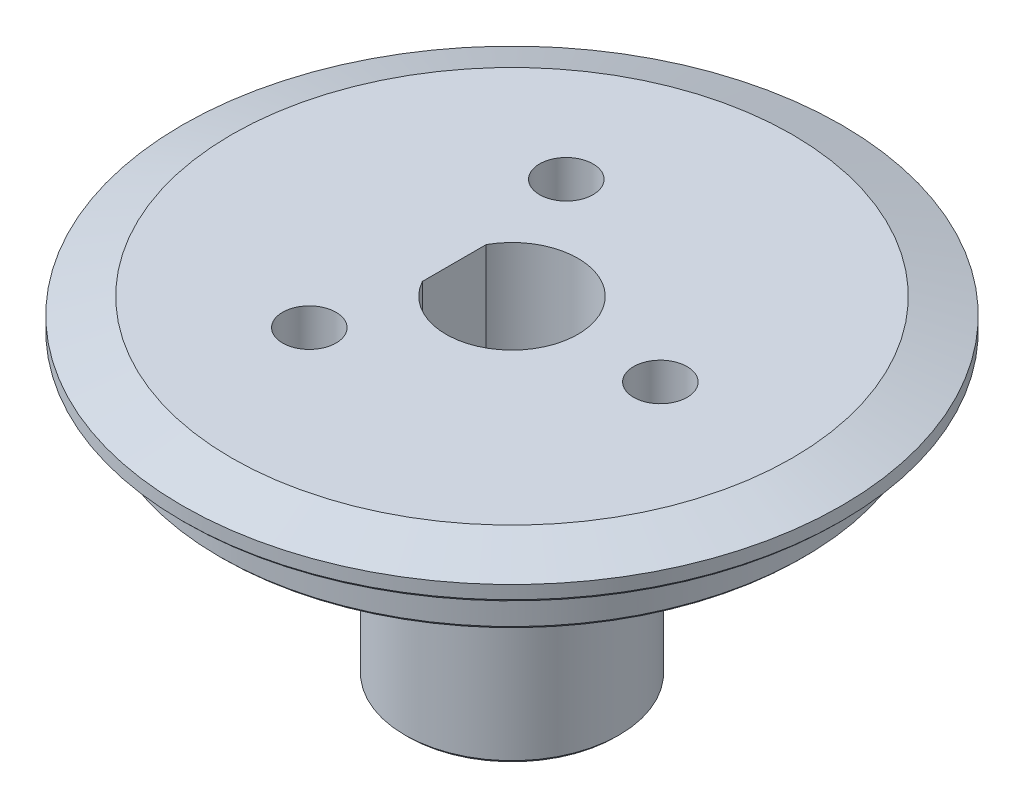
ISO-10303-21;
HEADER;
FILE_DESCRIPTION(('STEP AP214'),'2;1');
FILE_NAME('part.step','',(''),(''),'','','');
FILE_SCHEMA(('AUTOMOTIVE_DESIGN { 1 0 10303 214 1 1 1 1 }'));
ENDSEC;
DATA;
#1=APPLICATION_CONTEXT('core data for automotive mechanical design processes');
#2=APPLICATION_PROTOCOL_DEFINITION('international standard','automotive_design',2000,#1);
#3=PRODUCT_CONTEXT('',#1,'mechanical');
#4=PRODUCT('Part','Part','',(#3));
#5=PRODUCT_RELATED_PRODUCT_CATEGORY('part','',(#4));
#6=PRODUCT_DEFINITION_FORMATION('','',#4);
#7=PRODUCT_DEFINITION_CONTEXT('part definition',#1,'design');
#8=PRODUCT_DEFINITION('design','',#6,#7);
#9=PRODUCT_DEFINITION_SHAPE('','',#8);
#10=(LENGTH_UNIT() NAMED_UNIT(*) SI_UNIT(.MILLI.,.METRE.));
#11=(NAMED_UNIT(*) PLANE_ANGLE_UNIT() SI_UNIT($,.RADIAN.));
#12=(NAMED_UNIT(*) SI_UNIT($,.STERADIAN.) SOLID_ANGLE_UNIT());
#13=UNCERTAINTY_MEASURE_WITH_UNIT(LENGTH_MEASURE(1.E-05),#10,'distance_accuracy_value','');
#14=(GEOMETRIC_REPRESENTATION_CONTEXT(3) GLOBAL_UNCERTAINTY_ASSIGNED_CONTEXT((#13)) GLOBAL_UNIT_ASSIGNED_CONTEXT((#10,
#11,#12)) REPRESENTATION_CONTEXT('',''));
#15=CARTESIAN_POINT('',(0.,0.,0.));
#16=DIRECTION('',(0.,0.,1.));
#17=DIRECTION('',(1.,0.,0.));
#18=AXIS2_PLACEMENT_3D('',#15,#16,#17);
#19=CARTESIAN_POINT('',(0.,17.8,0.));
#20=DIRECTION('',(0.,-1.,0.));
#21=DIRECTION('',(0.,0.,-1.));
#22=AXIS2_PLACEMENT_3D('',#19,#20,#21);
#23=TOROIDAL_SURFACE('',#22,17.95,0.2);
#24=CARTESIAN_POINT('',(0.,17.8,0.));
#25=DIRECTION('',(0.,-1.,0.));
#26=DIRECTION('',(0.,0.,-1.));
#27=AXIS2_PLACEMENT_3D('',#24,#25,#26);
#28=CIRCLE('',#27,17.75);
#29=CARTESIAN_POINT('',(0.,17.8,-17.75));
#30=VERTEX_POINT('',#29);
#31=EDGE_CURVE('E110',#30,#30,#28,.T.);
#32=ORIENTED_EDGE('',*,*,#31,.F.);
#33=EDGE_LOOP('',(#32));
#34=FACE_BOUND('',#33,.T.);
#35=CARTESIAN_POINT('',(0.,18.,0.));
#36=DIRECTION('',(0.,-1.,0.));
#37=DIRECTION('',(1.,0.,0.));
#38=AXIS2_PLACEMENT_3D('',#35,#36,#37);
#39=CIRCLE('',#38,17.95);
#40=CARTESIAN_POINT('',(17.95,18.,0.));
#41=VERTEX_POINT('',#40);
#42=EDGE_CURVE('E113',#41,#41,#39,.F.);
#43=ORIENTED_EDGE('',*,*,#42,.F.);
#44=EDGE_LOOP('',(#43));
#45=FACE_BOUND('',#44,.T.);
#46=ADVANCED_FACE('F17',(#34,#45),#23,.F.);
#47=CARTESIAN_POINT('',(18.875,18.,0.));
#48=DIRECTION('',(0.,-1.,0.));
#49=DIRECTION('',(0.,0.,-1.));
#50=AXIS2_PLACEMENT_3D('',#47,#48,#49);
#51=PLANE('',#50);
#52=ORIENTED_EDGE('',*,*,#42,.T.);
#53=EDGE_LOOP('',(#52));
#54=FACE_BOUND('',#53,.T.);
#55=CARTESIAN_POINT('',(0.,17.9999999999103,0.));
#56=DIRECTION('',(0.,1.,0.));
#57=DIRECTION('',(0.,0.,1.));
#58=AXIS2_PLACEMENT_3D('',#55,#56,#57);
#59=CIRCLE('',#58,19.8000000000897);
#60=CARTESIAN_POINT('',(0.,17.9999999999103,19.8000000000897));
#61=VERTEX_POINT('',#60);
#62=EDGE_CURVE('E22',#61,#61,#59,.T.);
#63=ORIENTED_EDGE('',*,*,#62,.F.);
#64=EDGE_LOOP('',(#63));
#65=FACE_BOUND('',#64,.T.);
#66=ADVANCED_FACE('F124',(#54,#65),#51,.T.);
#67=CARTESIAN_POINT('',(0.,16.5,0.));
#68=DIRECTION('',(0.,-1.,0.));
#69=DIRECTION('',(0.,0.,-1.));
#70=AXIS2_PLACEMENT_3D('',#67,#68,#69);
#71=CYLINDRICAL_SURFACE('',#70,17.75);
#72=ORIENTED_EDGE('',*,*,#31,.T.);
#73=EDGE_LOOP('',(#72));
#74=FACE_BOUND('',#73,.T.);
#75=CARTESIAN_POINT('',(0.,15.2000000000898,0.));
#76=DIRECTION('',(0.,1.,0.));
#77=DIRECTION('',(-1.,0.,0.));
#78=AXIS2_PLACEMENT_3D('',#75,#76,#77);
#79=CIRCLE('',#78,17.7499999999103);
#80=CARTESIAN_POINT('',(-17.7499999999103,15.2000000000898,0.));
#81=VERTEX_POINT('',#80);
#82=EDGE_CURVE('E95',#81,#81,#79,.F.);
#83=ORIENTED_EDGE('',*,*,#82,.F.);
#84=EDGE_LOOP('',(#83));
#85=FACE_BOUND('',#84,.T.);
#86=ADVANCED_FACE('F133',(#74,#85),#71,.T.);
#87=CARTESIAN_POINT('',(0.,18.2000000000898,0.));
#88=DIRECTION('',(0.,1.,0.));
#89=DIRECTION('',(0.,0.,1.));
#90=AXIS2_PLACEMENT_3D('',#87,#88,#89);
#91=CONICAL_SURFACE('',#90,19.9999999999103,0.785398162500006);
#92=ORIENTED_EDGE('',*,*,#62,.T.);
#93=EDGE_LOOP('',(#92));
#94=FACE_BOUND('',#93,.T.);
#95=CARTESIAN_POINT('',(0.,18.2,0.));
#96=DIRECTION('',(0.,-1.,0.));
#97=DIRECTION('',(0.,0.,-1.));
#98=AXIS2_PLACEMENT_3D('',#95,#96,#97);
#99=CIRCLE('',#98,20.);
#100=CARTESIAN_POINT('',(0.,18.2,-20.));
#101=VERTEX_POINT('',#100);
#102=EDGE_CURVE('E68',#101,#101,#99,.F.);
#103=ORIENTED_EDGE('',*,*,#102,.F.);
#104=EDGE_LOOP('',(#103));
#105=FACE_BOUND('',#104,.T.);
#106=ADVANCED_FACE('F136',(#94,#105),#91,.T.);
#107=CARTESIAN_POINT('',(0.,0.200000000006639,0.));
#108=DIRECTION('',(0.,1.,0.));
#109=DIRECTION('',(0.,0.,1.));
#110=AXIS2_PLACEMENT_3D('',#107,#108,#109);
#111=CONICAL_SURFACE('',#110,6.4999999998463,0.785398162544797);
#112=CARTESIAN_POINT('',(0.,-5.6843418860808E-11,0.));
#113=DIRECTION('',(0.,1.,0.));
#114=DIRECTION('',(0.,0.,1.));
#115=AXIS2_PLACEMENT_3D('',#112,#113,#114);
#116=CIRCLE('',#115,6.30000000012387);
#117=CARTESIAN_POINT('',(0.,-5.6843418860808E-11,6.30000000012387));
#118=VERTEX_POINT('',#117);
#119=EDGE_CURVE('E71',#118,#118,#116,.F.);
#120=ORIENTED_EDGE('',*,*,#119,.F.);
#121=EDGE_LOOP('',(#120));
#122=FACE_BOUND('',#121,.T.);
#123=CARTESIAN_POINT('',(0.,0.200000000000002,0.));
#124=DIRECTION('',(0.,-1.,0.));
#125=DIRECTION('',(0.,0.,-1.));
#126=AXIS2_PLACEMENT_3D('',#123,#124,#125);
#127=CIRCLE('',#126,6.5);
#128=CARTESIAN_POINT('',(0.,0.200000000000002,-6.5));
#129=VERTEX_POINT('',#128);
#130=EDGE_CURVE('E103',#129,#129,#127,.F.);
#131=ORIENTED_EDGE('',*,*,#130,.F.);
#132=EDGE_LOOP('',(#131));
#133=FACE_BOUND('',#132,.T.);
#134=ADVANCED_FACE('F140',(#122,#133),#111,.T.);
#135=CARTESIAN_POINT('',(0.,7.4,0.));
#136=DIRECTION('',(0.,-1.,0.));
#137=DIRECTION('',(0.,0.,-1.));
#138=AXIS2_PLACEMENT_3D('',#135,#136,#137);
#139=CYLINDRICAL_SURFACE('',#138,6.5);
#140=ORIENTED_EDGE('',*,*,#130,.T.);
#141=EDGE_LOOP('',(#140));
#142=FACE_BOUND('',#141,.T.);
#143=CARTESIAN_POINT('',(-6.38265851742046,12.,1.2295));
#144=CARTESIAN_POINT('',(-6.38265984692852,11.9316045645532,1.2294973881982));
#145=CARTESIAN_POINT('',(-6.38376982853111,11.8631753732923,1.22377351491042));
#146=CARTESIAN_POINT('',(-6.38808416485507,11.7282473388449,1.20104516085471));
#147=CARTESIAN_POINT('',(-6.39129028320906,11.6617501704614,1.18403118071643));
#148=CARTESIAN_POINT('',(-6.39942108280584,11.5326579676506,1.13926448663492));
#149=CARTESIAN_POINT('',(-6.40434414880667,11.4700593306329,1.11152186314854));
#150=CARTESIAN_POINT('',(-6.41535222391576,11.3504085217607,1.04611223757229));
#151=CARTESIAN_POINT('',(-6.42143714568783,11.2933559334983,1.00844598135674));
#152=CARTESIAN_POINT('',(-6.43416938685307,11.1856901583608,0.923749867689093));
#153=CARTESIAN_POINT('',(-6.44082230539441,11.1351574048846,0.876618589434772));
#154=CARTESIAN_POINT('',(-6.45389149298033,11.042666714372,0.774549500036461));
#155=CARTESIAN_POINT('',(-6.46030774633268,11.0007093450971,0.719611172408978));
#156=CARTESIAN_POINT('',(-6.47224069852948,10.9262517188227,0.60295861521515));
#157=CARTESIAN_POINT('',(-6.47775003049831,10.8938273751944,0.541195113133705));
#158=CARTESIAN_POINT('',(-6.48718568546971,10.839845393928,0.412975669673148));
#159=CARTESIAN_POINT('',(-6.4911121409272,10.8182868470034,0.346520121471035));
#160=CARTESIAN_POINT('',(-6.49690008901105,10.7868973617431,0.211636670592778));
#161=CARTESIAN_POINT('',(-6.49878544333907,10.7769308013302,0.143241370150747));
#162=CARTESIAN_POINT('',(-6.50036102731914,10.7685855532961,0.00572518560850376));
#163=CARTESIAN_POINT('',(-6.50005144706339,10.7702058621947,-0.0633956351403604));
#164=CARTESIAN_POINT('',(-6.49729067013774,10.7848844934077,-0.199470452213251));
#165=CARTESIAN_POINT('',(-6.49486681827138,10.7977967770987,-0.266440836999921));
#166=CARTESIAN_POINT('',(-6.48818053587235,10.8344617675845,-0.397246891391606));
#167=CARTESIAN_POINT('',(-6.48391803746232,10.8582148745921,-0.461082445171098));
#168=CARTESIAN_POINT('',(-6.47398777911943,10.9160258985371,-0.584229479303634));
#169=CARTESIAN_POINT('',(-6.4683121121564,10.950142043926,-0.643512960833312));
#170=CARTESIAN_POINT('',(-6.45618292993325,11.0276677842696,-0.755568133767392));
#171=CARTESIAN_POINT('',(-6.44972933425267,11.0710783404195,-0.808339150785125));
#172=CARTESIAN_POINT('',(-6.43664001412973,11.1667649245491,-0.906736869184485));
#173=CARTESIAN_POINT('',(-6.43000301911082,11.2191687226896,-0.952239238036922));
#174=CARTESIAN_POINT('',(-6.41739109698971,11.3309290146013,-1.03382834102249));
#175=CARTESIAN_POINT('',(-6.41141617991898,11.3902856136896,-1.06991493250404));
#176=CARTESIAN_POINT('',(-6.40080298257213,11.5144332079634,-1.13168452074163));
#177=CARTESIAN_POINT('',(-6.3961670619603,11.5792335402315,-1.15734918322625));
#178=CARTESIAN_POINT('',(-6.38879267933443,11.7123339811219,-1.19739165675913));
#179=CARTESIAN_POINT('',(-6.38605399820907,11.7806336846246,-1.21177077119564));
#180=CARTESIAN_POINT('',(-6.38282759758134,11.9176721891392,-1.22865189344075));
#181=CARTESIAN_POINT('',(-6.38230600502479,11.9863881967268,-1.23133264782439));
#182=CARTESIAN_POINT('',(-6.3834821580087,12.1232859082247,-1.22522034178228));
#183=CARTESIAN_POINT('',(-6.385179791738,12.1914676388792,-1.21642785941202));
#184=CARTESIAN_POINT('',(-6.39057154223964,12.3247720283442,-1.18777219967491));
#185=CARTESIAN_POINT('',(-6.39424871038872,12.3899156275666,-1.16800295996883));
#186=CARTESIAN_POINT('',(-6.40317056964399,12.5159658347798,-1.11805473315938));
#187=CARTESIAN_POINT('',(-6.40841537805466,12.5768721252775,-1.08787496702383));
#188=CARTESIAN_POINT('',(-6.41995856239572,12.6935055852521,-1.01755185571003));
#189=CARTESIAN_POINT('',(-6.42626858088907,12.7491635817175,-0.977295731939867));
#190=CARTESIAN_POINT('',(-6.43919855944274,12.8529992495843,-0.888114480893286));
#191=CARTESIAN_POINT('',(-6.44581854784635,12.9011762351851,-0.83918855971683));
#192=CARTESIAN_POINT('',(-6.45873154904431,12.9893513846589,-0.733257676792186));
#193=CARTESIAN_POINT('',(-6.46501888225646,13.0292292507852,-0.67615177925616));
#194=CARTESIAN_POINT('',(-6.47646218660609,13.0988246146,-0.555947139691109));
#195=CARTESIAN_POINT('',(-6.48161820183423,13.1285425082765,-0.492848631348427));
#196=CARTESIAN_POINT('',(-6.49019352428617,13.1767948724754,-0.362780203537517));
#197=CARTESIAN_POINT('',(-6.4936219403327,13.1953880976403,-0.29583270759082));
#198=CARTESIAN_POINT('',(-6.49839465940366,13.2210506718959,-0.159694100980465));
#199=CARTESIAN_POINT('',(-6.49973918578493,13.2281212560182,-0.0905032315792477));
#200=CARTESIAN_POINT('',(-6.50018808421391,13.2304942177056,0.0470049863756515));
#201=CARTESIAN_POINT('',(-6.49932702221688,13.2259781788712,0.115319154656494));
#202=CARTESIAN_POINT('',(-6.49553343134807,13.2057042032387,0.25019663506988));
#203=CARTESIAN_POINT('',(-6.49260092309827,13.1899463783566,0.316759964625808));
#204=CARTESIAN_POINT('',(-6.48499405073512,13.1477132028999,0.446148086911425));
#205=CARTESIAN_POINT('',(-6.48032288159764,13.1212575031609,0.508979493381665));
#206=CARTESIAN_POINT('',(-6.46974400074753,13.058401473664,0.629338452041358));
#207=CARTESIAN_POINT('',(-6.46383620423766,13.0220004618904,0.686865640123464));
#208=CARTESIAN_POINT('',(-6.45132716994624,12.9396636789052,0.795887128288251));
#209=CARTESIAN_POINT('',(-6.44471709334101,12.8935968839666,0.847281471962612));
#210=CARTESIAN_POINT('',(-6.43160384990375,12.7935077454892,0.941673242226883));
#211=CARTESIAN_POINT('',(-6.42510070860119,12.7394835320114,0.984668689593987));
#212=CARTESIAN_POINT('',(-6.41287046425405,12.6244024801754,1.06142426630563));
#213=CARTESIAN_POINT('',(-6.40715127020864,12.5632840435169,1.09509334163762));
#214=CARTESIAN_POINT('',(-6.39723180681658,12.4361692940305,1.15163183949048));
#215=CARTESIAN_POINT('',(-6.39303011174931,12.3701776302922,1.17451140518374));
#216=CARTESIAN_POINT('',(-6.38749268508418,12.2533307307099,1.20419888457119));
#217=CARTESIAN_POINT('',(-6.38569069792407,12.2031573964286,1.21367045031139));
#218=CARTESIAN_POINT('',(-6.38327313500378,12.1019956174784,1.22632189355216));
#219=CARTESIAN_POINT('',(-6.38265752591457,12.0510071957485,1.22950194780083));
#220=CARTESIAN_POINT('',(-6.38265851742046,12.,1.2295));
#221=B_SPLINE_CURVE_WITH_KNOTS('',3,(#143,#144,#145,#146,#147,#148,#149,#150,#151,#152,#153,
#154,#155,#156,#157,#158,#159,#160,#161,#162,#163,#164,#165,#166,#167,#168,#169,#170,#171,#172,
#173,#174,#175,#176,#177,#178,#179,#180,#181,#182,#183,#184,#185,#186,#187,#188,#189,#190,#191,
#192,#193,#194,#195,#196,#197,#198,#199,#200,#201,#202,#203,#204,#205,#206,#207,#208,#209,#210,
#211,#212,#213,#214,#215,#216,#217,#218,#219,#220),.UNSPECIFIED.,.T.,.F.,(4,2,2,2,2,2,2,2,2,2,2,
2,2,2,2,2,2,2,2,2,2,2,2,2,2,2,2,2,2,2,2,2,2,2,2,2,2,2,4),(0.,0.204999631936086,
0.410171967356864,0.615151802458567,0.820116235378235,1.02740692281973,1.23471133018255,
1.44362441170712,1.65252000777835,1.85894620204363,2.06535451899724,2.26913219885693,
2.4729174022244,2.67786951835829,2.88284284016674,3.0910146516452,3.29918961679988,
3.50772923343174,3.71624476190246,3.92156284022576,4.12687057441821,4.33044780478239,
4.53404027238099,4.74002216275099,4.94602292479784,5.1548286608492,5.36362625770542,
5.57131113150164,5.77897374354033,5.98340184908871,6.18782791951076,6.39188017495206,
6.59594642712062,6.80298182309223,7.01006594881869,7.21910579645072,7.42794873290439,
7.5808353992874,7.73371777054833),.UNSPECIFIED.);
#222=CARTESIAN_POINT('',(-6.38265851742046,12.,1.2295));
#223=VERTEX_POINT('',#222);
#224=EDGE_CURVE('E149',#223,#223,#221,.T.);
#225=ORIENTED_EDGE('',*,*,#224,.T.);
#226=EDGE_LOOP('',(#225));
#227=FACE_BOUND('',#226,.T.);
#228=CARTESIAN_POINT('',(0.,14.8,0.));
#229=DIRECTION('',(0.,-1.,0.));
#230=DIRECTION('',(0.,0.,-1.));
#231=AXIS2_PLACEMENT_3D('',#228,#229,#230);
#232=CIRCLE('',#231,6.5);
#233=CARTESIAN_POINT('',(0.,14.8,-6.5));
#234=VERTEX_POINT('',#233);
#235=EDGE_CURVE('E72',#234,#234,#232,.T.);
#236=ORIENTED_EDGE('',*,*,#235,.T.);
#237=EDGE_LOOP('',(#236));
#238=FACE_BOUND('',#237,.T.);
#239=ADVANCED_FACE('F143',(#142,#227,#238),#139,.T.);
#240=CARTESIAN_POINT('',(0.,15.2000000000898,0.));
#241=DIRECTION('',(0.,1.,0.));
#242=DIRECTION('',(0.,0.,1.));
#243=AXIS2_PLACEMENT_3D('',#240,#241,#242);
#244=CONICAL_SURFACE('',#243,17.7499999999103,0.78539816249998);
#245=CARTESIAN_POINT('',(0.,14.9999999999103,0.));
#246=DIRECTION('',(0.,1.,0.));
#247=DIRECTION('',(0.,0.,1.));
#248=AXIS2_PLACEMENT_3D('',#245,#246,#247);
#249=CIRCLE('',#248,17.5500000000897);
#250=CARTESIAN_POINT('',(0.,14.9999999999103,17.5500000000897));
#251=VERTEX_POINT('',#250);
#252=EDGE_CURVE('E155',#251,#251,#249,.F.);
#253=ORIENTED_EDGE('',*,*,#252,.F.);
#254=EDGE_LOOP('',(#253));
#255=FACE_BOUND('',#254,.T.);
#256=ORIENTED_EDGE('',*,*,#82,.T.);
#257=EDGE_LOOP('',(#256));
#258=FACE_BOUND('',#257,.T.);
#259=ADVANCED_FACE('F85',(#255,#258),#244,.T.);
#260=CARTESIAN_POINT('',(0.,14.8,0.));
#261=DIRECTION('',(0.,-1.,0.));
#262=DIRECTION('',(0.,0.,-1.));
#263=AXIS2_PLACEMENT_3D('',#260,#261,#262);
#264=TOROIDAL_SURFACE('',#263,6.7,0.2);
#265=CARTESIAN_POINT('',(0.,15.,0.));
#266=DIRECTION('',(0.,-1.,0.));
#267=DIRECTION('',(1.,0.,0.));
#268=AXIS2_PLACEMENT_3D('',#265,#266,#267);
#269=CIRCLE('',#268,6.7);
#270=CARTESIAN_POINT('',(6.7,15.,0.));
#271=VERTEX_POINT('',#270);
#272=EDGE_CURVE('E228',#271,#271,#269,.F.);
#273=ORIENTED_EDGE('',*,*,#272,.F.);
#274=EDGE_LOOP('',(#273));
#275=FACE_BOUND('',#274,.T.);
#276=ORIENTED_EDGE('',*,*,#235,.F.);
#277=EDGE_LOOP('',(#276));
#278=FACE_BOUND('',#277,.T.);
#279=ADVANCED_FACE('F79',(#275,#278),#264,.F.);
#280=CARTESIAN_POINT('',(0.,19.,0.));
#281=DIRECTION('',(0.,-1.,0.));
#282=DIRECTION('',(0.,0.,-1.));
#283=AXIS2_PLACEMENT_3D('',#280,#281,#282);
#284=CYLINDRICAL_SURFACE('',#283,20.);
#285=CARTESIAN_POINT('',(0.,18.9999999978591,0.));
#286=DIRECTION('',(0.,-1.,0.));
#287=DIRECTION('',(-1.,0.,0.));
#288=AXIS2_PLACEMENT_3D('',#285,#286,#287);
#289=CIRCLE('',#288,19.9999999992864);
#290=CARTESIAN_POINT('',(-19.9999999992864,18.9999999978591,0.));
#291=VERTEX_POINT('',#290);
#292=EDGE_CURVE('E50',#291,#291,#289,.F.);
#293=ORIENTED_EDGE('',*,*,#292,.F.);
#294=EDGE_LOOP('',(#293));
#295=FACE_BOUND('',#294,.T.);
#296=ORIENTED_EDGE('',*,*,#102,.T.);
#297=EDGE_LOOP('',(#296));
#298=FACE_BOUND('',#297,.T.);
#299=ADVANCED_FACE('F84',(#295,#298),#284,.T.);
#300=CARTESIAN_POINT('',(3.25,0.,0.));
#301=DIRECTION('',(0.,-1.,0.));
#302=DIRECTION('',(0.,0.,-1.));
#303=AXIS2_PLACEMENT_3D('',#300,#301,#302);
#304=PLANE('',#303);
#305=CARTESIAN_POINT('',(0.,0.,0.));
#306=DIRECTION('',(0.,1.,0.));
#307=DIRECTION('',(0.,0.,1.));
#308=AXIS2_PLACEMENT_3D('',#305,#306,#307);
#309=CIRCLE('',#308,4.);
#310=CARTESIAN_POINT('',(-3.5,0.,1.93649167310371));
#311=VERTEX_POINT('',#310);
#312=CARTESIAN_POINT('',(-3.5,0.,-1.93649167310371));
#313=VERTEX_POINT('',#312);
#314=EDGE_CURVE('E46',#311,#313,#309,.T.);
#315=ORIENTED_EDGE('',*,*,#314,.T.);
#316=DIRECTION('',(0.,0.,-1.));
#317=VECTOR('',#316,1.);
#318=CARTESIAN_POINT('',(-3.5,0.,1.93649167310371));
#319=LINE('',#318,#317);
#320=EDGE_CURVE('E45',#311,#313,#319,.T.);
#321=ORIENTED_EDGE('',*,*,#320,.F.);
#322=EDGE_LOOP('',(#315,#321));
#323=FACE_BOUND('',#322,.T.);
#324=ORIENTED_EDGE('',*,*,#119,.T.);
#325=EDGE_LOOP('',(#324));
#326=FACE_BOUND('',#325,.T.);
#327=ADVANCED_FACE('F48',(#323,#326),#304,.T.);
#328=CARTESIAN_POINT('',(-63.5,12.,0.));
#329=DIRECTION('',(1.,0.,0.));
#330=DIRECTION('',(0.,0.,-1.));
#331=AXIS2_PLACEMENT_3D('',#328,#329,#330);
#332=CYLINDRICAL_SURFACE('',#331,1.2295);
#333=CARTESIAN_POINT('',(-3.5,12.,0.));
#334=DIRECTION('',(1.,0.,0.));
#335=DIRECTION('',(0.,0.,-1.));
#336=AXIS2_PLACEMENT_3D('',#333,#334,#335);
#337=CIRCLE('',#336,1.2295);
#338=CARTESIAN_POINT('',(-3.5,12.,-1.2295));
#339=VERTEX_POINT('',#338);
#340=EDGE_CURVE('E221',#339,#339,#337,.F.);
#341=ORIENTED_EDGE('',*,*,#340,.F.);
#342=EDGE_LOOP('',(#341));
#343=FACE_BOUND('',#342,.T.);
#344=ORIENTED_EDGE('',*,*,#224,.F.);
#345=EDGE_LOOP('',(#344));
#346=FACE_BOUND('',#345,.T.);
#347=ADVANCED_FACE('F156',(#343,#346),#332,.F.);
#348=CARTESIAN_POINT('',(12.225,15.,0.));
#349=DIRECTION('',(0.,-1.,0.));
#350=DIRECTION('',(0.,0.,-1.));
#351=AXIS2_PLACEMENT_3D('',#348,#349,#350);
#352=PLANE('',#351);
#353=CARTESIAN_POINT('',(-4.5,15.,7.79422863405995));
#354=DIRECTION('',(0.,1.,0.));
#355=DIRECTION('',(0.,0.,1.));
#356=AXIS2_PLACEMENT_3D('',#353,#354,#355);
#357=CIRCLE('',#356,1.621);
#358=CARTESIAN_POINT('',(-4.5,15.,9.41522863405995));
#359=VERTEX_POINT('',#358);
#360=EDGE_CURVE('E207',#359,#359,#357,.T.);
#361=ORIENTED_EDGE('',*,*,#360,.T.);
#362=EDGE_LOOP('',(#361));
#363=FACE_BOUND('',#362,.T.);
#364=CARTESIAN_POINT('',(-4.5,15.,-7.79422863405995));
#365=DIRECTION('',(0.,1.,0.));
#366=DIRECTION('',(0.,0.,1.));
#367=AXIS2_PLACEMENT_3D('',#364,#365,#366);
#368=CIRCLE('',#367,1.621);
#369=CARTESIAN_POINT('',(-4.5,15.,-6.17322863405995));
#370=VERTEX_POINT('',#369);
#371=EDGE_CURVE('E212',#370,#370,#368,.T.);
#372=ORIENTED_EDGE('',*,*,#371,.T.);
#373=EDGE_LOOP('',(#372));
#374=FACE_BOUND('',#373,.T.);
#375=CARTESIAN_POINT('',(9.,15.,0.));
#376=DIRECTION('',(0.,1.,0.));
#377=DIRECTION('',(0.,0.,1.));
#378=AXIS2_PLACEMENT_3D('',#375,#376,#377);
#379=CIRCLE('',#378,1.621);
#380=CARTESIAN_POINT('',(9.,15.,1.621));
#381=VERTEX_POINT('',#380);
#382=EDGE_CURVE('E218',#381,#381,#379,.T.);
#383=ORIENTED_EDGE('',*,*,#382,.T.);
#384=EDGE_LOOP('',(#383));
#385=FACE_BOUND('',#384,.T.);
#386=ORIENTED_EDGE('',*,*,#272,.T.);
#387=EDGE_LOOP('',(#386));
#388=FACE_BOUND('',#387,.T.);
#389=ORIENTED_EDGE('',*,*,#252,.T.);
#390=EDGE_LOOP('',(#389));
#391=FACE_BOUND('',#390,.T.);
#392=ADVANCED_FACE('F159',(#363,#374,#385,#388,#391),#352,.T.);
#393=CARTESIAN_POINT('',(0.,18.9999999978591,0.));
#394=DIRECTION('',(0.,-1.,0.));
#395=DIRECTION('',(0.,0.,-1.));
#396=AXIS2_PLACEMENT_3D('',#393,#394,#395);
#397=CONICAL_SURFACE('',#396,19.9999999992864,1.24904577097101);
#398=ORIENTED_EDGE('',*,*,#292,.T.);
#399=EDGE_LOOP('',(#398));
#400=FACE_BOUND('',#399,.T.);
#401=CARTESIAN_POINT('',(0.,20.0000000021409,0.));
#402=DIRECTION('',(0.,-1.,0.));
#403=DIRECTION('',(0.,0.,-1.));
#404=AXIS2_PLACEMENT_3D('',#401,#402,#403);
#405=CIRCLE('',#404,17.0000000007136);
#406=CARTESIAN_POINT('',(0.,20.0000000021409,-17.0000000007136));
#407=VERTEX_POINT('',#406);
#408=EDGE_CURVE('E205',#407,#407,#405,.F.);
#409=ORIENTED_EDGE('',*,*,#408,.F.);
#410=EDGE_LOOP('',(#409));
#411=FACE_BOUND('',#410,.T.);
#412=ADVANCED_FACE('F193',(#400,#411),#397,.T.);
#413=CARTESIAN_POINT('',(0.,-40.,0.));
#414=DIRECTION('',(0.,1.,0.));
#415=DIRECTION('',(0.,0.,1.));
#416=AXIS2_PLACEMENT_3D('',#413,#414,#415);
#417=CYLINDRICAL_SURFACE('',#416,4.);
#418=CARTESIAN_POINT('',(0.,20.,0.));
#419=DIRECTION('',(0.,1.,0.));
#420=DIRECTION('',(0.,0.,1.));
#421=AXIS2_PLACEMENT_3D('',#418,#419,#420);
#422=CIRCLE('',#421,4.);
#423=CARTESIAN_POINT('',(-3.5,20.,-1.93649167310371));
#424=VERTEX_POINT('',#423);
#425=CARTESIAN_POINT('',(-3.5,20.,1.93649167310371));
#426=VERTEX_POINT('',#425);
#427=EDGE_CURVE('E56',#424,#426,#422,.F.);
#428=ORIENTED_EDGE('',*,*,#427,.F.);
#429=DIRECTION('',(0.,1.,0.));
#430=VECTOR('',#429,1.);
#431=CARTESIAN_POINT('',(-3.5,20.,-1.93649167310371));
#432=LINE('',#431,#430);
#433=EDGE_CURVE('E53',#313,#424,#432,.T.);
#434=ORIENTED_EDGE('',*,*,#433,.F.);
#435=ORIENTED_EDGE('',*,*,#314,.F.);
#436=DIRECTION('',(0.,1.,0.));
#437=VECTOR('',#436,1.);
#438=CARTESIAN_POINT('',(-3.5,20.,1.93649167310371));
#439=LINE('',#438,#437);
#440=EDGE_CURVE('E37',#426,#311,#439,.F.);
#441=ORIENTED_EDGE('',*,*,#440,.F.);
#442=EDGE_LOOP('',(#428,#434,#435,#441));
#443=FACE_BOUND('',#442,.T.);
#444=ADVANCED_FACE('F54',(#443),#417,.F.);
#445=CARTESIAN_POINT('',(-3.5,20.,1.93649167310371));
#446=DIRECTION('',(1.,0.,0.));
#447=DIRECTION('',(0.,0.,-1.));
#448=AXIS2_PLACEMENT_3D('',#445,#446,#447);
#449=PLANE('',#448);
#450=ORIENTED_EDGE('',*,*,#340,.T.);
#451=EDGE_LOOP('',(#450));
#452=FACE_BOUND('',#451,.T.);
#453=DIRECTION('',(0.,0.,1.));
#454=VECTOR('',#453,1.);
#455=CARTESIAN_POINT('',(-3.5,20.,0.));
#456=LINE('',#455,#454);
#457=EDGE_CURVE('E209',#426,#424,#456,.F.);
#458=ORIENTED_EDGE('',*,*,#457,.F.);
#459=ORIENTED_EDGE('',*,*,#440,.T.);
#460=ORIENTED_EDGE('',*,*,#320,.T.);
#461=ORIENTED_EDGE('',*,*,#433,.T.);
#462=EDGE_LOOP('',(#458,#459,#460,#461));
#463=FACE_BOUND('',#462,.T.);
#464=ADVANCED_FACE('F60',(#452,#463),#449,.T.);
#465=CARTESIAN_POINT('',(9.,-40.,0.));
#466=DIRECTION('',(0.,1.,0.));
#467=DIRECTION('',(0.,0.,1.));
#468=AXIS2_PLACEMENT_3D('',#465,#466,#467);
#469=CYLINDRICAL_SURFACE('',#468,1.621);
#470=CARTESIAN_POINT('',(9.,20.,0.));
#471=DIRECTION('',(0.,1.,0.));
#472=DIRECTION('',(0.,0.,1.));
#473=AXIS2_PLACEMENT_3D('',#470,#471,#472);
#474=CIRCLE('',#473,1.621);
#475=CARTESIAN_POINT('',(9.,20.,1.621));
#476=VERTEX_POINT('',#475);
#477=EDGE_CURVE('E369',#476,#476,#474,.F.);
#478=ORIENTED_EDGE('',*,*,#477,.F.);
#479=EDGE_LOOP('',(#478));
#480=FACE_BOUND('',#479,.T.);
#481=ORIENTED_EDGE('',*,*,#382,.F.);
#482=EDGE_LOOP('',(#481));
#483=FACE_BOUND('',#482,.T.);
#484=ADVANCED_FACE('F184',(#480,#483),#469,.F.);
#485=CARTESIAN_POINT('',(-4.5,-40.,-7.79422863405995));
#486=DIRECTION('',(0.,1.,0.));
#487=DIRECTION('',(0.,0.,1.));
#488=AXIS2_PLACEMENT_3D('',#485,#486,#487);
#489=CYLINDRICAL_SURFACE('',#488,1.621);
#490=CARTESIAN_POINT('',(-4.5,20.,-7.79422863405995));
#491=DIRECTION('',(0.,1.,0.));
#492=DIRECTION('',(0.,0.,1.));
#493=AXIS2_PLACEMENT_3D('',#490,#491,#492);
#494=CIRCLE('',#493,1.621);
#495=CARTESIAN_POINT('',(-4.5,20.,-6.17322863405995));
#496=VERTEX_POINT('',#495);
#497=EDGE_CURVE('E28',#496,#496,#494,.F.);
#498=ORIENTED_EDGE('',*,*,#497,.F.);
#499=EDGE_LOOP('',(#498));
#500=FACE_BOUND('',#499,.T.);
#501=ORIENTED_EDGE('',*,*,#371,.F.);
#502=EDGE_LOOP('',(#501));
#503=FACE_BOUND('',#502,.T.);
#504=ADVANCED_FACE('F177',(#500,#503),#489,.F.);
#505=CARTESIAN_POINT('',(-4.5,-40.,7.79422863405995));
#506=DIRECTION('',(0.,1.,0.));
#507=DIRECTION('',(0.,0.,1.));
#508=AXIS2_PLACEMENT_3D('',#505,#506,#507);
#509=CYLINDRICAL_SURFACE('',#508,1.621);
#510=CARTESIAN_POINT('',(-4.5,20.,7.79422863405995));
#511=DIRECTION('',(0.,1.,0.));
#512=DIRECTION('',(0.,0.,1.));
#513=AXIS2_PLACEMENT_3D('',#510,#511,#512);
#514=CIRCLE('',#513,1.621);
#515=CARTESIAN_POINT('',(-4.5,20.,9.41522863405995));
#516=VERTEX_POINT('',#515);
#517=EDGE_CURVE('E11',#516,#516,#514,.F.);
#518=ORIENTED_EDGE('',*,*,#517,.F.);
#519=EDGE_LOOP('',(#518));
#520=FACE_BOUND('',#519,.T.);
#521=ORIENTED_EDGE('',*,*,#360,.F.);
#522=EDGE_LOOP('',(#521));
#523=FACE_BOUND('',#522,.T.);
#524=ADVANCED_FACE('F171',(#520,#523),#509,.F.);
#525=CARTESIAN_POINT('',(10.,20.,0.));
#526=DIRECTION('',(0.,1.,0.));
#527=DIRECTION('',(0.,0.,1.));
#528=AXIS2_PLACEMENT_3D('',#525,#526,#527);
#529=PLANE('',#528);
#530=ORIENTED_EDGE('',*,*,#517,.T.);
#531=EDGE_LOOP('',(#530));
#532=FACE_BOUND('',#531,.T.);
#533=ORIENTED_EDGE('',*,*,#497,.T.);
#534=EDGE_LOOP('',(#533));
#535=FACE_BOUND('',#534,.T.);
#536=ORIENTED_EDGE('',*,*,#477,.T.);
#537=EDGE_LOOP('',(#536));
#538=FACE_BOUND('',#537,.T.);
#539=ORIENTED_EDGE('',*,*,#427,.T.);
#540=ORIENTED_EDGE('',*,*,#457,.T.);
#541=EDGE_LOOP('',(#539,#540));
#542=FACE_BOUND('',#541,.T.);
#543=ORIENTED_EDGE('',*,*,#408,.T.);
#544=EDGE_LOOP('',(#543));
#545=FACE_BOUND('',#544,.T.);
#546=ADVANCED_FACE('F169',(#532,#535,#538,#542,#545),#529,.T.);
#547=CLOSED_SHELL('',(#46,#66,#86,#106,#134,#239,#259,#279,#299,#327,#347,#392,#412,#444,#464,
#484,#504,#524,#546));
#548=MANIFOLD_SOLID_BREP('B1',#547);
#549=ADVANCED_BREP_SHAPE_REPRESENTATION('',(#18,#548),#14);
#550=SHAPE_DEFINITION_REPRESENTATION(#9,#549);
ENDSEC;
END-ISO-10303-21;
